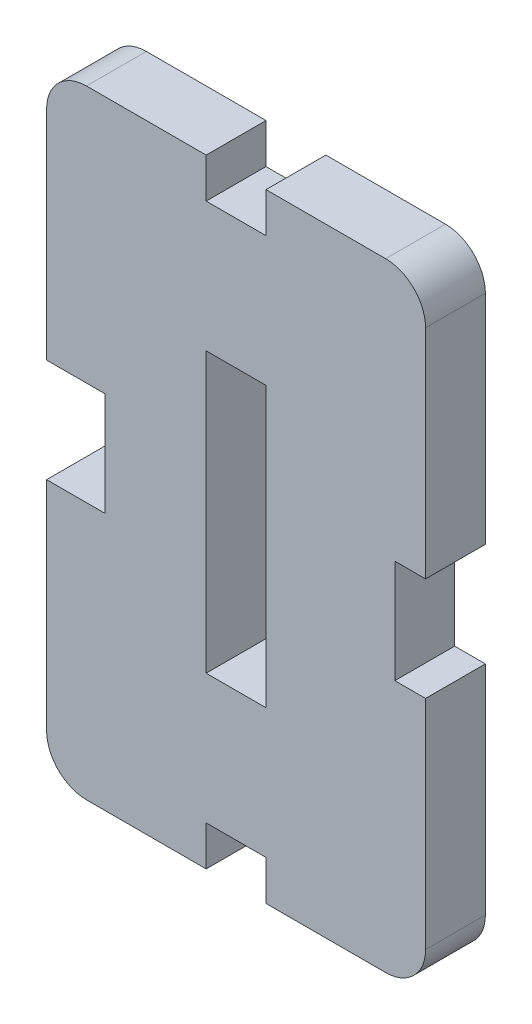
ISO-10303-21;
HEADER;
FILE_DESCRIPTION(('STEP AP214'),'2;1');
FILE_NAME('part.step','',(''),(''),'','','');
FILE_SCHEMA(('AUTOMOTIVE_DESIGN { 1 0 10303 214 1 1 1 1 }'));
ENDSEC;
DATA;
#1=APPLICATION_CONTEXT('core data for automotive mechanical design processes');
#2=APPLICATION_PROTOCOL_DEFINITION('international standard','automotive_design',2000,#1);
#3=PRODUCT_CONTEXT('',#1,'mechanical');
#4=PRODUCT('Part','Part','',(#3));
#5=PRODUCT_RELATED_PRODUCT_CATEGORY('part','',(#4));
#6=PRODUCT_DEFINITION_FORMATION('','',#4);
#7=PRODUCT_DEFINITION_CONTEXT('part definition',#1,'design');
#8=PRODUCT_DEFINITION('design','',#6,#7);
#9=PRODUCT_DEFINITION_SHAPE('','',#8);
#10=(LENGTH_UNIT() NAMED_UNIT(*) SI_UNIT(.MILLI.,.METRE.));
#11=(NAMED_UNIT(*) PLANE_ANGLE_UNIT() SI_UNIT($,.RADIAN.));
#12=(NAMED_UNIT(*) SI_UNIT($,.STERADIAN.) SOLID_ANGLE_UNIT());
#13=UNCERTAINTY_MEASURE_WITH_UNIT(LENGTH_MEASURE(1.E-05),#10,'distance_accuracy_value','');
#14=(GEOMETRIC_REPRESENTATION_CONTEXT(3) GLOBAL_UNCERTAINTY_ASSIGNED_CONTEXT((#13)) GLOBAL_UNIT_ASSIGNED_CONTEXT((#10,
#11,#12)) REPRESENTATION_CONTEXT('',''));
#15=CARTESIAN_POINT('',(0.,0.,0.));
#16=DIRECTION('',(0.,0.,1.));
#17=DIRECTION('',(1.,0.,0.));
#18=AXIS2_PLACEMENT_3D('',#15,#16,#17);
#19=CARTESIAN_POINT('',(-1050.11691061095,53.9977448376062,3.00000000000038));
#20=DIRECTION('',(0.,0.,-1.));
#21=DIRECTION('',(-1.,0.,0.));
#22=AXIS2_PLACEMENT_3D('',#19,#20,#21);
#23=PLANE('',#22);
#24=CARTESIAN_POINT('',(-1050.11691061095,53.9977448376062,3.00000000000038));
#25=DIRECTION('',(0.,0.,1.));
#26=DIRECTION('',(-1.,0.,0.));
#27=AXIS2_PLACEMENT_3D('',#24,#25,#26);
#28=CIRCLE('',#27,2.);
#29=CARTESIAN_POINT('',(-1050.11691061095,55.9977448376063,3.00000000000045));
#30=VERTEX_POINT('',#29);
#31=CARTESIAN_POINT('',(-1052.11691061095,53.9977448376064,3.00000000000049));
#32=VERTEX_POINT('',#31);
#33=EDGE_CURVE('E303',#30,#32,#28,.T.);
#34=ORIENTED_EDGE('',*,*,#33,.T.);
#35=DIRECTION('',(0.,-1.,0.));
#36=VECTOR('',#35,1.);
#37=CARTESIAN_POINT('',(-1052.11691061095,43.093073911834,3.00000000000038));
#38=LINE('',#37,#36);
#39=CARTESIAN_POINT('',(-1052.11691061095,43.093073911834,3.00000000000038));
#40=VERTEX_POINT('',#39);
#41=EDGE_CURVE('E306',#32,#40,#38,.T.);
#42=ORIENTED_EDGE('',*,*,#41,.T.);
#43=DIRECTION('',(1.,0.,0.));
#44=VECTOR('',#43,1.);
#45=CARTESIAN_POINT('',(-1049.19041833405,43.0930739118337,3.00000000000042));
#46=LINE('',#45,#44);
#47=CARTESIAN_POINT('',(-1049.19041833405,43.0930739118337,3.00000000000042));
#48=VERTEX_POINT('',#47);
#49=EDGE_CURVE('E308',#40,#48,#46,.T.);
#50=ORIENTED_EDGE('',*,*,#49,.T.);
#51=DIRECTION('',(0.,-1.,0.));
#52=VECTOR('',#51,1.);
#53=CARTESIAN_POINT('',(-1049.19041833405,37.9024157633789,3.00000000000038));
#54=LINE('',#53,#52);
#55=CARTESIAN_POINT('',(-1049.19041833405,37.9024157633789,3.00000000000038));
#56=VERTEX_POINT('',#55);
#57=EDGE_CURVE('E310',#48,#56,#54,.T.);
#58=ORIENTED_EDGE('',*,*,#57,.T.);
#59=DIRECTION('',(-1.,0.,0.));
#60=VECTOR('',#59,1.);
#61=CARTESIAN_POINT('',(-1049.19041833405,37.9024157633789,3.00000000000038));
#62=LINE('',#61,#60);
#63=CARTESIAN_POINT('',(-1052.11691061095,37.9024157633791,3.00000000000039));
#64=VERTEX_POINT('',#63);
#65=EDGE_CURVE('E312',#56,#64,#62,.T.);
#66=ORIENTED_EDGE('',*,*,#65,.T.);
#67=DIRECTION('',(0.,-1.,0.));
#68=VECTOR('',#67,1.);
#69=CARTESIAN_POINT('',(-1052.11691061095,37.9024157633791,3.00000000000039));
#70=LINE('',#69,#68);
#71=CARTESIAN_POINT('',(-1052.11691061095,26.9977448376063,3.00000000000045));
#72=VERTEX_POINT('',#71);
#73=EDGE_CURVE('E314',#64,#72,#70,.T.);
#74=ORIENTED_EDGE('',*,*,#73,.T.);
#75=CARTESIAN_POINT('',(-1050.11691061095,26.9977448376061,3.00000000000056));
#76=DIRECTION('',(0.,0.,1.));
#77=DIRECTION('',(1.,0.,0.));
#78=AXIS2_PLACEMENT_3D('',#75,#76,#77);
#79=CIRCLE('',#78,2.00000000000011);
#80=CARTESIAN_POINT('',(-1050.11691061095,24.9977448376062,3.00000000000047));
#81=VERTEX_POINT('',#80);
#82=EDGE_CURVE('E316',#72,#81,#79,.T.);
#83=ORIENTED_EDGE('',*,*,#82,.T.);
#84=DIRECTION('',(1.,0.,0.));
#85=VECTOR('',#84,1.);
#86=CARTESIAN_POINT('',(-1050.11691061095,24.9977448376063,3.00000000000038));
#87=LINE('',#86,#85);
#88=CARTESIAN_POINT('',(-1044.11691061095,24.9977448376066,3.00000000000061));
#89=VERTEX_POINT('',#88);
#90=EDGE_CURVE('E318',#81,#89,#87,.T.);
#91=ORIENTED_EDGE('',*,*,#90,.T.);
#92=DIRECTION('',(0.,1.,0.));
#93=VECTOR('',#92,1.);
#94=CARTESIAN_POINT('',(-1044.11691061095,26.9977448376066,3.00000000000067));
#95=LINE('',#94,#93);
#96=CARTESIAN_POINT('',(-1044.11691061095,26.9977448376066,3.00000000000067));
#97=VERTEX_POINT('',#96);
#98=EDGE_CURVE('E320',#89,#97,#95,.T.);
#99=ORIENTED_EDGE('',*,*,#98,.T.);
#100=DIRECTION('',(1.,0.,0.));
#101=VECTOR('',#100,1.);
#102=CARTESIAN_POINT('',(-1042.61691061095,26.9977448376064,3.00000000000041));
#103=LINE('',#102,#101);
#104=CARTESIAN_POINT('',(-1041.11691061095,26.9977448376063,3.00000000000039));
#105=VERTEX_POINT('',#104);
#106=EDGE_CURVE('E322',#97,#105,#103,.T.);
#107=ORIENTED_EDGE('',*,*,#106,.T.);
#108=DIRECTION('',(0.,-1.,0.));
#109=VECTOR('',#108,1.);
#110=CARTESIAN_POINT('',(-1041.11691061095,26.9977448376063,3.00000000000039));
#111=LINE('',#110,#109);
#112=CARTESIAN_POINT('',(-1041.11691061095,24.9977448376063,3.00000000000035));
#113=VERTEX_POINT('',#112);
#114=EDGE_CURVE('E324',#105,#113,#111,.T.);
#115=ORIENTED_EDGE('',*,*,#114,.T.);
#116=DIRECTION('',(1.,0.,0.));
#117=VECTOR('',#116,1.);
#118=CARTESIAN_POINT('',(-1041.11691061095,24.9977448376063,3.00000000000035));
#119=LINE('',#118,#117);
#120=CARTESIAN_POINT('',(-1035.11691061095,24.9977448376063,3.00000000000034));
#121=VERTEX_POINT('',#120);
#122=EDGE_CURVE('E326',#113,#121,#119,.T.);
#123=ORIENTED_EDGE('',*,*,#122,.T.);
#124=CARTESIAN_POINT('',(-1035.11691061095,26.9977448376062,3.00000000000032));
#125=DIRECTION('',(0.,0.,1.));
#126=DIRECTION('',(-1.,0.,0.));
#127=AXIS2_PLACEMENT_3D('',#124,#125,#126);
#128=CIRCLE('',#127,2.);
#129=CARTESIAN_POINT('',(-1033.11691061095,26.9977448376063,3.0000000000005));
#130=VERTEX_POINT('',#129);
#131=EDGE_CURVE('E328',#121,#130,#128,.T.);
#132=ORIENTED_EDGE('',*,*,#131,.T.);
#133=DIRECTION('',(0.,1.,0.));
#134=VECTOR('',#133,1.);
#135=CARTESIAN_POINT('',(-1033.11691061095,26.9977448376063,3.0000000000005));
#136=LINE('',#135,#134);
#137=CARTESIAN_POINT('',(-1033.11691061095,37.902415763379,3.00000000000042));
#138=VERTEX_POINT('',#137);
#139=EDGE_CURVE('E330',#130,#138,#136,.T.);
#140=ORIENTED_EDGE('',*,*,#139,.T.);
#141=DIRECTION('',(-0.999999999999999,0.,0.));
#142=VECTOR('',#141,1.);
#143=CARTESIAN_POINT('',(-1033.11691061095,37.902415763379,3.00000000000042));
#144=LINE('',#143,#142);
#145=CARTESIAN_POINT('',(-1034.65769352971,37.9024157633789,3.00000000000046));
#146=VERTEX_POINT('',#145);
#147=EDGE_CURVE('E332',#138,#146,#144,.T.);
#148=ORIENTED_EDGE('',*,*,#147,.T.);
#149=DIRECTION('',(0.,1.,0.));
#150=VECTOR('',#149,1.);
#151=CARTESIAN_POINT('',(-1034.65769352971,43.0930739118337,3.00000000000032));
#152=LINE('',#151,#150);
#153=CARTESIAN_POINT('',(-1034.65769352971,43.0930739118337,3.00000000000032));
#154=VERTEX_POINT('',#153);
#155=EDGE_CURVE('E334',#146,#154,#152,.T.);
#156=ORIENTED_EDGE('',*,*,#155,.T.);
#157=DIRECTION('',(0.999999999999999,0.,0.));
#158=VECTOR('',#157,1.);
#159=CARTESIAN_POINT('',(-1033.11691061095,43.0930739118337,3.00000000000043));
#160=LINE('',#159,#158);
#161=CARTESIAN_POINT('',(-1033.11691061095,43.0930739118337,3.00000000000043));
#162=VERTEX_POINT('',#161);
#163=EDGE_CURVE('E336',#154,#162,#160,.T.);
#164=ORIENTED_EDGE('',*,*,#163,.T.);
#165=DIRECTION('',(0.,1.,0.));
#166=VECTOR('',#165,1.);
#167=CARTESIAN_POINT('',(-1033.11691061095,53.9977448376064,3.00000000000049));
#168=LINE('',#167,#166);
#169=CARTESIAN_POINT('',(-1033.11691061095,53.9977448376064,3.00000000000049));
#170=VERTEX_POINT('',#169);
#171=EDGE_CURVE('E338',#162,#170,#168,.T.);
#172=ORIENTED_EDGE('',*,*,#171,.T.);
#173=CARTESIAN_POINT('',(-1035.11691061095,53.9977448376063,3.00000000000039));
#174=DIRECTION('',(0.,0.,1.));
#175=DIRECTION('',(1.,0.,0.));
#176=AXIS2_PLACEMENT_3D('',#173,#174,#175);
#177=CIRCLE('',#176,2.);
#178=CARTESIAN_POINT('',(-1035.11691061095,55.9977448376063,3.00000000000036));
#179=VERTEX_POINT('',#178);
#180=EDGE_CURVE('E340',#170,#179,#177,.T.);
#181=ORIENTED_EDGE('',*,*,#180,.T.);
#182=DIRECTION('',(-1.,0.,0.));
#183=VECTOR('',#182,1.);
#184=CARTESIAN_POINT('',(-1041.11691061095,55.9977448376064,3.00000000000034));
#185=LINE('',#184,#183);
#186=CARTESIAN_POINT('',(-1041.11691061095,55.9977448376064,3.00000000000034));
#187=VERTEX_POINT('',#186);
#188=EDGE_CURVE('E342',#179,#187,#185,.T.);
#189=ORIENTED_EDGE('',*,*,#188,.T.);
#190=DIRECTION('',(0.,-1.,0.));
#191=VECTOR('',#190,1.);
#192=CARTESIAN_POINT('',(-1041.11691061095,53.9977448376065,3.00000000000043));
#193=LINE('',#192,#191);
#194=CARTESIAN_POINT('',(-1041.11691061095,53.9977448376065,3.00000000000043));
#195=VERTEX_POINT('',#194);
#196=EDGE_CURVE('E344',#187,#195,#193,.T.);
#197=ORIENTED_EDGE('',*,*,#196,.T.);
#198=DIRECTION('',(-1.,0.,0.));
#199=VECTOR('',#198,1.);
#200=CARTESIAN_POINT('',(-1042.61691061095,53.9977448376063,3.00000000000035));
#201=LINE('',#200,#199);
#202=CARTESIAN_POINT('',(-1044.11691061095,53.9977448376064,3.00000000000056));
#203=VERTEX_POINT('',#202);
#204=EDGE_CURVE('E346',#195,#203,#201,.T.);
#205=ORIENTED_EDGE('',*,*,#204,.T.);
#206=DIRECTION('',(0.,1.,0.));
#207=VECTOR('',#206,1.);
#208=CARTESIAN_POINT('',(-1044.11691061095,53.9977448376064,3.00000000000056));
#209=LINE('',#208,#207);
#210=CARTESIAN_POINT('',(-1044.11691061095,55.9977448376066,3.00000000000063));
#211=VERTEX_POINT('',#210);
#212=EDGE_CURVE('E348',#203,#211,#209,.T.);
#213=ORIENTED_EDGE('',*,*,#212,.T.);
#214=DIRECTION('',(-1.,0.,0.));
#215=VECTOR('',#214,1.);
#216=CARTESIAN_POINT('',(-1050.11691061095,55.9977448376063,3.00000000000045));
#217=LINE('',#216,#215);
#218=EDGE_CURVE('E350',#211,#30,#217,.T.);
#219=ORIENTED_EDGE('',*,*,#218,.T.);
#220=EDGE_LOOP('',(#34,#42,#50,#58,#66,#74,#83,#91,#99,#107,#115,#123,#132,#140,#148,#156,#164,
#172,#181,#189,#197,#205,#213,#219));
#221=FACE_BOUND('',#220,.T.);
#222=DIRECTION('',(-1.,0.,0.));
#223=VECTOR('',#222,1.);
#224=CARTESIAN_POINT('',(-1041.11691061095,47.4977448376063,3.00000000000041));
#225=LINE('',#224,#223);
#226=CARTESIAN_POINT('',(-1041.11691061095,47.4977448376063,3.00000000000041));
#227=VERTEX_POINT('',#226);
#228=CARTESIAN_POINT('',(-1044.11691061095,47.4977448376066,3.00000000000046));
#229=VERTEX_POINT('',#228);
#230=EDGE_CURVE('E232',#227,#229,#225,.T.);
#231=ORIENTED_EDGE('',*,*,#230,.F.);
#232=DIRECTION('',(0.,1.,0.));
#233=VECTOR('',#232,1.);
#234=CARTESIAN_POINT('',(-1041.11691061095,33.4977448376063,3.00000000000035));
#235=LINE('',#234,#233);
#236=CARTESIAN_POINT('',(-1041.11691061095,33.4977448376063,3.00000000000035));
#237=VERTEX_POINT('',#236);
#238=EDGE_CURVE('E247',#237,#227,#235,.T.);
#239=ORIENTED_EDGE('',*,*,#238,.F.);
#240=DIRECTION('',(1.,0.,0.));
#241=VECTOR('',#240,1.);
#242=CARTESIAN_POINT('',(-1041.11691061095,33.4977448376063,3.00000000000035));
#243=LINE('',#242,#241);
#244=CARTESIAN_POINT('',(-1044.11691061095,33.4977448376066,3.00000000000053));
#245=VERTEX_POINT('',#244);
#246=EDGE_CURVE('E245',#245,#237,#243,.T.);
#247=ORIENTED_EDGE('',*,*,#246,.F.);
#248=DIRECTION('',(0.,-1.,0.));
#249=VECTOR('',#248,1.);
#250=CARTESIAN_POINT('',(-1044.11691061095,47.4977448376066,3.00000000000046));
#251=LINE('',#250,#249);
#252=EDGE_CURVE('E243',#229,#245,#251,.T.);
#253=ORIENTED_EDGE('',*,*,#252,.F.);
#254=EDGE_LOOP('',(#231,#239,#247,#253));
#255=FACE_BOUND('',#254,.T.);
#256=ADVANCED_FACE('F32',(#221,#255),#23,.F.);
#257=CARTESIAN_POINT('',(-1050.11691061095,53.9977448376063,3.7470027081099E-13));
#258=DIRECTION('',(0.,0.,-1.));
#259=DIRECTION('',(-1.,0.,0.));
#260=AXIS2_PLACEMENT_3D('',#257,#258,#259);
#261=PLANE('',#260);
#262=CARTESIAN_POINT('',(-1050.11691061095,53.9977448376063,3.7470027081099E-13));
#263=DIRECTION('',(0.,0.,1.));
#264=DIRECTION('',(-1.,0.,0.));
#265=AXIS2_PLACEMENT_3D('',#262,#263,#264);
#266=CIRCLE('',#265,2.);
#267=CARTESIAN_POINT('',(-1050.11691061095,55.9977448376063,5.27355936696949E-13));
#268=VERTEX_POINT('',#267);
#269=CARTESIAN_POINT('',(-1052.11691061095,53.9977448376064,3.60822483003176E-13));
#270=VERTEX_POINT('',#269);
#271=EDGE_CURVE('E233',#268,#270,#266,.T.);
#272=ORIENTED_EDGE('',*,*,#271,.F.);
#273=DIRECTION('',(-1.,0.,0.));
#274=VECTOR('',#273,1.);
#275=CARTESIAN_POINT('',(-1050.11691061095,55.9977448376063,5.27355936696949E-13));
#276=LINE('',#275,#274);
#277=CARTESIAN_POINT('',(-1044.11691061095,55.9977448376066,6.52256026967279E-13));
#278=VERTEX_POINT('',#277);
#279=EDGE_CURVE('E301',#278,#268,#276,.T.);
#280=ORIENTED_EDGE('',*,*,#279,.F.);
#281=DIRECTION('',(0.,1.,0.));
#282=VECTOR('',#281,1.);
#283=CARTESIAN_POINT('',(-1044.11691061095,53.9977448376066,6.66133814775094E-13));
#284=LINE('',#283,#282);
#285=CARTESIAN_POINT('',(-1044.11691061095,53.9977448376066,6.66133814775094E-13));
#286=VERTEX_POINT('',#285);
#287=EDGE_CURVE('E299',#286,#278,#284,.T.);
#288=ORIENTED_EDGE('',*,*,#287,.F.);
#289=DIRECTION('',(-1.,0.,0.));
#290=VECTOR('',#289,1.);
#291=CARTESIAN_POINT('',(-1042.61691061095,53.9977448376063,3.88578058618805E-13));
#292=LINE('',#291,#290);
#293=CARTESIAN_POINT('',(-1041.11691061095,53.9977448376064,3.46944695195361E-13));
#294=VERTEX_POINT('',#293);
#295=EDGE_CURVE('E297',#294,#286,#292,.T.);
#296=ORIENTED_EDGE('',*,*,#295,.F.);
#297=DIRECTION('',(0.,-1.,0.));
#298=VECTOR('',#297,1.);
#299=CARTESIAN_POINT('',(-1041.11691061095,53.9977448376064,3.46944695195361E-13));
#300=LINE('',#299,#298);
#301=CARTESIAN_POINT('',(-1041.11691061095,55.9977448376064,4.16333634234434E-13));
#302=VERTEX_POINT('',#301);
#303=EDGE_CURVE('E294',#302,#294,#300,.T.);
#304=ORIENTED_EDGE('',*,*,#303,.F.);
#305=DIRECTION('',(-1.,0.,0.));
#306=VECTOR('',#305,1.);
#307=CARTESIAN_POINT('',(-1041.11691061095,55.9977448376064,4.16333634234434E-13));
#308=LINE('',#307,#306);
#309=CARTESIAN_POINT('',(-1035.11691061095,55.9977448376063,3.88578058618805E-13));
#310=VERTEX_POINT('',#309);
#311=EDGE_CURVE('E292',#310,#302,#308,.T.);
#312=ORIENTED_EDGE('',*,*,#311,.F.);
#313=CARTESIAN_POINT('',(-1035.11691061095,53.9977448376063,3.33066907387547E-13));
#314=DIRECTION('',(0.,0.,1.));
#315=DIRECTION('',(1.,0.,0.));
#316=AXIS2_PLACEMENT_3D('',#313,#314,#315);
#317=CIRCLE('',#316,2.);
#318=CARTESIAN_POINT('',(-1033.11691061095,53.9977448376063,5.13478148889135E-13));
#319=VERTEX_POINT('',#318);
#320=EDGE_CURVE('E290',#319,#310,#317,.T.);
#321=ORIENTED_EDGE('',*,*,#320,.F.);
#322=DIRECTION('',(0.,1.,0.));
#323=VECTOR('',#322,1.);
#324=CARTESIAN_POINT('',(-1033.11691061095,53.9977448376063,5.13478148889135E-13));
#325=LINE('',#324,#323);
#326=CARTESIAN_POINT('',(-1033.11691061095,43.0930739118338,4.85722573273506E-13));
#327=VERTEX_POINT('',#326);
#328=EDGE_CURVE('E288',#327,#319,#325,.T.);
#329=ORIENTED_EDGE('',*,*,#328,.F.);
#330=DIRECTION('',(0.999999999999999,0.,0.));
#331=VECTOR('',#330,1.);
#332=CARTESIAN_POINT('',(-1033.11691061095,43.0930739118338,4.85722573273506E-13));
#333=LINE('',#332,#331);
#334=CARTESIAN_POINT('',(-1034.65769352971,43.0930739118337,3.19189119579733E-13));
#335=VERTEX_POINT('',#334);
#336=EDGE_CURVE('E286',#335,#327,#333,.T.);
#337=ORIENTED_EDGE('',*,*,#336,.F.);
#338=DIRECTION('',(0.,1.,0.));
#339=VECTOR('',#338,1.);
#340=CARTESIAN_POINT('',(-1034.65769352971,43.0930739118337,3.19189119579733E-13));
#341=LINE('',#340,#339);
#342=CARTESIAN_POINT('',(-1034.65769352971,37.9024157633789,2.35922392732846E-13));
#343=VERTEX_POINT('',#342);
#344=EDGE_CURVE('E284',#343,#335,#341,.T.);
#345=ORIENTED_EDGE('',*,*,#344,.F.);
#346=DIRECTION('',(-0.999999999999999,0.,0.));
#347=VECTOR('',#346,1.);
#348=CARTESIAN_POINT('',(-1033.11691061095,37.9024157633789,4.44089209850063E-13));
#349=LINE('',#348,#347);
#350=CARTESIAN_POINT('',(-1033.11691061095,37.9024157633789,4.44089209850063E-13));
#351=VERTEX_POINT('',#350);
#352=EDGE_CURVE('E282',#351,#343,#349,.T.);
#353=ORIENTED_EDGE('',*,*,#352,.F.);
#354=DIRECTION('',(0.,1.,0.));
#355=VECTOR('',#354,1.);
#356=CARTESIAN_POINT('',(-1033.11691061095,26.9977448376063,4.44089209850063E-13));
#357=LINE('',#356,#355);
#358=CARTESIAN_POINT('',(-1033.11691061095,26.9977448376063,4.44089209850063E-13));
#359=VERTEX_POINT('',#358);
#360=EDGE_CURVE('E280',#359,#351,#357,.T.);
#361=ORIENTED_EDGE('',*,*,#360,.F.);
#362=CARTESIAN_POINT('',(-1035.11691061095,26.9977448376063,3.19189119579733E-13));
#363=DIRECTION('',(0.,0.,1.));
#364=DIRECTION('',(-1.,0.,0.));
#365=AXIS2_PLACEMENT_3D('',#362,#363,#364);
#366=CIRCLE('',#365,2.);
#367=CARTESIAN_POINT('',(-1035.11691061095,24.9977448376063,3.46944695195361E-13));
#368=VERTEX_POINT('',#367);
#369=EDGE_CURVE('E278',#368,#359,#366,.T.);
#370=ORIENTED_EDGE('',*,*,#369,.F.);
#371=DIRECTION('',(1.,0.,0.));
#372=VECTOR('',#371,1.);
#373=CARTESIAN_POINT('',(-1041.11691061095,24.9977448376063,3.33066907387547E-13));
#374=LINE('',#373,#372);
#375=CARTESIAN_POINT('',(-1041.11691061095,24.9977448376063,3.33066907387547E-13));
#376=VERTEX_POINT('',#375);
#377=EDGE_CURVE('E276',#376,#368,#374,.T.);
#378=ORIENTED_EDGE('',*,*,#377,.F.);
#379=DIRECTION('',(0.,-1.,0.));
#380=VECTOR('',#379,1.);
#381=CARTESIAN_POINT('',(-1041.11691061095,26.9977448376064,4.57966997657877E-13));
#382=LINE('',#381,#380);
#383=CARTESIAN_POINT('',(-1041.11691061095,26.9977448376064,4.57966997657877E-13));
#384=VERTEX_POINT('',#383);
#385=EDGE_CURVE('E274',#384,#376,#382,.T.);
#386=ORIENTED_EDGE('',*,*,#385,.F.);
#387=DIRECTION('',(1.,0.,0.));
#388=VECTOR('',#387,1.);
#389=CARTESIAN_POINT('',(-1042.61691061095,26.9977448376063,4.30211422042248E-13));
#390=LINE('',#389,#388);
#391=CARTESIAN_POINT('',(-1044.11691061095,26.9977448376065,5.96744875736022E-13));
#392=VERTEX_POINT('',#391);
#393=EDGE_CURVE('E272',#392,#384,#390,.T.);
#394=ORIENTED_EDGE('',*,*,#393,.F.);
#395=DIRECTION('',(0.,1.,0.));
#396=VECTOR('',#395,1.);
#397=CARTESIAN_POINT('',(-1044.11691061095,26.9977448376065,5.96744875736022E-13));
#398=LINE('',#397,#396);
#399=CARTESIAN_POINT('',(-1044.11691061095,24.9977448376066,5.41233724504764E-13));
#400=VERTEX_POINT('',#399);
#401=EDGE_CURVE('E269',#400,#392,#398,.T.);
#402=ORIENTED_EDGE('',*,*,#401,.F.);
#403=DIRECTION('',(1.,0.,0.));
#404=VECTOR('',#403,1.);
#405=CARTESIAN_POINT('',(-1050.11691061095,24.9977448376063,4.71844785465692E-13));
#406=LINE('',#405,#404);
#407=CARTESIAN_POINT('',(-1050.11691061095,24.9977448376062,5.13478148889135E-13));
#408=VERTEX_POINT('',#407);
#409=EDGE_CURVE('E267',#408,#400,#406,.T.);
#410=ORIENTED_EDGE('',*,*,#409,.F.);
#411=CARTESIAN_POINT('',(-1050.11691061095,26.9977448376064,4.30211422042248E-13));
#412=DIRECTION('',(0.,0.,1.));
#413=DIRECTION('',(1.,0.,0.));
#414=AXIS2_PLACEMENT_3D('',#411,#412,#413);
#415=CIRCLE('',#414,2.00000000000011);
#416=CARTESIAN_POINT('',(-1052.11691061095,26.9977448376064,4.57966997657877E-13));
#417=VERTEX_POINT('',#416);
#418=EDGE_CURVE('E265',#417,#408,#415,.T.);
#419=ORIENTED_EDGE('',*,*,#418,.F.);
#420=DIRECTION('',(0.,-1.,0.));
#421=VECTOR('',#420,1.);
#422=CARTESIAN_POINT('',(-1052.11691061095,37.9024157633791,4.30211422042248E-13));
#423=LINE('',#422,#421);
#424=CARTESIAN_POINT('',(-1052.11691061095,37.9024157633791,4.30211422042248E-13));
#425=VERTEX_POINT('',#424);
#426=EDGE_CURVE('E263',#425,#417,#423,.T.);
#427=ORIENTED_EDGE('',*,*,#426,.F.);
#428=DIRECTION('',(-1.,0.,0.));
#429=VECTOR('',#428,1.);
#430=CARTESIAN_POINT('',(-1049.19041833405,37.9024157633789,3.19189119579733E-13));
#431=LINE('',#430,#429);
#432=CARTESIAN_POINT('',(-1049.19041833405,37.9024157633789,3.19189119579733E-13));
#433=VERTEX_POINT('',#432);
#434=EDGE_CURVE('E261',#433,#425,#431,.T.);
#435=ORIENTED_EDGE('',*,*,#434,.F.);
#436=DIRECTION('',(0.,-1.,0.));
#437=VECTOR('',#436,1.);
#438=CARTESIAN_POINT('',(-1049.19041833405,37.9024157633789,3.19189119579733E-13));
#439=LINE('',#438,#437);
#440=CARTESIAN_POINT('',(-1049.19041833405,43.0930739118337,3.46944695195361E-13));
#441=VERTEX_POINT('',#440);
#442=EDGE_CURVE('E259',#441,#433,#439,.T.);
#443=ORIENTED_EDGE('',*,*,#442,.F.);
#444=DIRECTION('',(1.,0.,0.));
#445=VECTOR('',#444,1.);
#446=CARTESIAN_POINT('',(-1049.19041833405,43.0930739118337,3.46944695195361E-13));
#447=LINE('',#446,#445);
#448=CARTESIAN_POINT('',(-1052.11691061095,43.093073911834,4.16333634234434E-13));
#449=VERTEX_POINT('',#448);
#450=EDGE_CURVE('E257',#449,#441,#447,.T.);
#451=ORIENTED_EDGE('',*,*,#450,.F.);
#452=DIRECTION('',(0.,-1.,0.));
#453=VECTOR('',#452,1.);
#454=CARTESIAN_POINT('',(-1052.11691061095,43.093073911834,4.16333634234434E-13));
#455=LINE('',#454,#453);
#456=EDGE_CURVE('E255',#270,#449,#455,.T.);
#457=ORIENTED_EDGE('',*,*,#456,.F.);
#458=EDGE_LOOP('',(#272,#280,#288,#296,#304,#312,#321,#329,#337,#345,#353,#361,#370,#378,#386,
#394,#402,#410,#419,#427,#435,#443,#451,#457));
#459=FACE_BOUND('',#458,.T.);
#460=DIRECTION('',(0.,1.,0.));
#461=VECTOR('',#460,1.);
#462=CARTESIAN_POINT('',(-1041.11691061095,33.4977448376063,3.46944695195361E-13));
#463=LINE('',#462,#461);
#464=CARTESIAN_POINT('',(-1041.11691061095,33.4977448376063,3.46944695195361E-13));
#465=VERTEX_POINT('',#464);
#466=CARTESIAN_POINT('',(-1041.11691061095,47.4977448376063,3.19189119579733E-13));
#467=VERTEX_POINT('',#466);
#468=EDGE_CURVE('E237',#465,#467,#463,.T.);
#469=ORIENTED_EDGE('',*,*,#468,.T.);
#470=DIRECTION('',(-1.,0.,0.));
#471=VECTOR('',#470,1.);
#472=CARTESIAN_POINT('',(-1041.11691061095,47.4977448376063,3.19189119579733E-13));
#473=LINE('',#472,#471);
#474=CARTESIAN_POINT('',(-1044.11691061095,47.4977448376065,4.44089209850063E-13));
#475=VERTEX_POINT('',#474);
#476=EDGE_CURVE('E55',#467,#475,#473,.T.);
#477=ORIENTED_EDGE('',*,*,#476,.T.);
#478=DIRECTION('',(0.,-1.,0.));
#479=VECTOR('',#478,1.);
#480=CARTESIAN_POINT('',(-1044.11691061095,47.4977448376065,4.44089209850063E-13));
#481=LINE('',#480,#479);
#482=CARTESIAN_POINT('',(-1044.11691061095,33.4977448376066,4.57966997657877E-13));
#483=VERTEX_POINT('',#482);
#484=EDGE_CURVE('E219',#475,#483,#481,.T.);
#485=ORIENTED_EDGE('',*,*,#484,.T.);
#486=DIRECTION('',(1.,0.,0.));
#487=VECTOR('',#486,1.);
#488=CARTESIAN_POINT('',(-1041.11691061095,33.4977448376063,3.46944695195361E-13));
#489=LINE('',#488,#487);
#490=EDGE_CURVE('E228',#483,#465,#489,.T.);
#491=ORIENTED_EDGE('',*,*,#490,.T.);
#492=EDGE_LOOP('',(#469,#477,#485,#491));
#493=FACE_BOUND('',#492,.T.);
#494=ADVANCED_FACE('F236',(#459,#493),#261,.T.);
#495=CARTESIAN_POINT('',(-1050.11691061095,53.9977448376062,3.00000000000038));
#496=DIRECTION('',(0.,0.,-1.));
#497=DIRECTION('',(-1.,0.,0.));
#498=AXIS2_PLACEMENT_3D('',#495,#496,#497);
#499=CYLINDRICAL_SURFACE('',#498,2.);
#500=ORIENTED_EDGE('',*,*,#271,.T.);
#501=DIRECTION('',(0.,0.,-1.));
#502=VECTOR('',#501,1.);
#503=CARTESIAN_POINT('',(-1052.11691061095,53.9977448376064,3.00000000000049));
#504=LINE('',#503,#502);
#505=EDGE_CURVE('E11',#32,#270,#504,.T.);
#506=ORIENTED_EDGE('',*,*,#505,.F.);
#507=ORIENTED_EDGE('',*,*,#33,.F.);
#508=DIRECTION('',(0.,0.,-1.));
#509=VECTOR('',#508,1.);
#510=CARTESIAN_POINT('',(-1050.11691061095,55.9977448376063,3.00000000000045));
#511=LINE('',#510,#509);
#512=EDGE_CURVE('E352',#30,#268,#511,.T.);
#513=ORIENTED_EDGE('',*,*,#512,.T.);
#514=EDGE_LOOP('',(#500,#506,#507,#513));
#515=FACE_BOUND('',#514,.T.);
#516=ADVANCED_FACE('F34',(#515),#499,.T.);
#517=CARTESIAN_POINT('',(-1052.11691061095,43.093073911834,3.00000000000038));
#518=DIRECTION('',(0.999999999999999,0.,0.));
#519=DIRECTION('',(0.,1.,0.));
#520=AXIS2_PLACEMENT_3D('',#517,#518,#519);
#521=PLANE('',#520);
#522=ORIENTED_EDGE('',*,*,#456,.T.);
#523=DIRECTION('',(0.,0.,-1.));
#524=VECTOR('',#523,1.);
#525=CARTESIAN_POINT('',(-1052.11691061095,43.093073911834,3.00000000000038));
#526=LINE('',#525,#524);
#527=EDGE_CURVE('E40',#40,#449,#526,.T.);
#528=ORIENTED_EDGE('',*,*,#527,.F.);
#529=ORIENTED_EDGE('',*,*,#41,.F.);
#530=ORIENTED_EDGE('',*,*,#505,.T.);
#531=EDGE_LOOP('',(#522,#528,#529,#530));
#532=FACE_BOUND('',#531,.T.);
#533=ADVANCED_FACE('F444',(#532),#521,.F.);
#534=CARTESIAN_POINT('',(-1049.19041833405,43.0930739118337,3.00000000000042));
#535=DIRECTION('',(0.,1.,0.));
#536=DIRECTION('',(0.,0.,1.));
#537=AXIS2_PLACEMENT_3D('',#534,#535,#536);
#538=PLANE('',#537);
#539=ORIENTED_EDGE('',*,*,#450,.T.);
#540=DIRECTION('',(0.,0.,-1.));
#541=VECTOR('',#540,1.);
#542=CARTESIAN_POINT('',(-1049.19041833405,43.0930739118337,3.00000000000042));
#543=LINE('',#542,#541);
#544=EDGE_CURVE('E415',#48,#441,#543,.T.);
#545=ORIENTED_EDGE('',*,*,#544,.F.);
#546=ORIENTED_EDGE('',*,*,#49,.F.);
#547=ORIENTED_EDGE('',*,*,#527,.T.);
#548=EDGE_LOOP('',(#539,#545,#546,#547));
#549=FACE_BOUND('',#548,.T.);
#550=ADVANCED_FACE('F422',(#549),#538,.F.);
#551=CARTESIAN_POINT('',(-1049.19041833405,37.9024157633789,3.00000000000038));
#552=DIRECTION('',(1.,0.,0.));
#553=DIRECTION('',(0.,0.,-1.));
#554=AXIS2_PLACEMENT_3D('',#551,#552,#553);
#555=PLANE('',#554);
#556=ORIENTED_EDGE('',*,*,#442,.T.);
#557=DIRECTION('',(0.,0.,-1.));
#558=VECTOR('',#557,1.);
#559=CARTESIAN_POINT('',(-1049.19041833405,37.9024157633789,3.00000000000038));
#560=LINE('',#559,#558);
#561=EDGE_CURVE('E412',#56,#433,#560,.T.);
#562=ORIENTED_EDGE('',*,*,#561,.F.);
#563=ORIENTED_EDGE('',*,*,#57,.F.);
#564=ORIENTED_EDGE('',*,*,#544,.T.);
#565=EDGE_LOOP('',(#556,#562,#563,#564));
#566=FACE_BOUND('',#565,.T.);
#567=ADVANCED_FACE('F432',(#566),#555,.F.);
#568=CARTESIAN_POINT('',(-1049.19041833405,37.9024157633789,3.00000000000038));
#569=DIRECTION('',(0.,-1.,0.));
#570=DIRECTION('',(0.,0.,-1.));
#571=AXIS2_PLACEMENT_3D('',#568,#569,#570);
#572=PLANE('',#571);
#573=ORIENTED_EDGE('',*,*,#434,.T.);
#574=DIRECTION('',(0.,0.,-1.));
#575=VECTOR('',#574,1.);
#576=CARTESIAN_POINT('',(-1052.11691061095,37.9024157633791,3.00000000000039));
#577=LINE('',#576,#575);
#578=EDGE_CURVE('E409',#64,#425,#577,.T.);
#579=ORIENTED_EDGE('',*,*,#578,.F.);
#580=ORIENTED_EDGE('',*,*,#65,.F.);
#581=ORIENTED_EDGE('',*,*,#561,.T.);
#582=EDGE_LOOP('',(#573,#579,#580,#581));
#583=FACE_BOUND('',#582,.T.);
#584=ADVANCED_FACE('F436',(#583),#572,.F.);
#585=CARTESIAN_POINT('',(-1052.11691061095,37.9024157633791,3.00000000000039));
#586=DIRECTION('',(1.,0.,0.));
#587=DIRECTION('',(0.,1.,0.));
#588=AXIS2_PLACEMENT_3D('',#585,#586,#587);
#589=PLANE('',#588);
#590=ORIENTED_EDGE('',*,*,#426,.T.);
#591=DIRECTION('',(0.,0.,-1.));
#592=VECTOR('',#591,1.);
#593=CARTESIAN_POINT('',(-1052.11691061095,26.9977448376063,3.00000000000045));
#594=LINE('',#593,#592);
#595=EDGE_CURVE('E406',#72,#417,#594,.T.);
#596=ORIENTED_EDGE('',*,*,#595,.F.);
#597=ORIENTED_EDGE('',*,*,#73,.F.);
#598=ORIENTED_EDGE('',*,*,#578,.T.);
#599=EDGE_LOOP('',(#590,#596,#597,#598));
#600=FACE_BOUND('',#599,.T.);
#601=ADVANCED_FACE('F535',(#600),#589,.F.);
#602=CARTESIAN_POINT('',(-1050.11691061095,26.9977448376061,3.00000000000056));
#603=DIRECTION('',(0.,0.,-1.));
#604=DIRECTION('',(-1.,0.,0.));
#605=AXIS2_PLACEMENT_3D('',#602,#603,#604);
#606=CYLINDRICAL_SURFACE('',#605,2.00000000000011);
#607=ORIENTED_EDGE('',*,*,#418,.T.);
#608=DIRECTION('',(0.,0.,-1.));
#609=VECTOR('',#608,1.);
#610=CARTESIAN_POINT('',(-1050.11691061095,24.9977448376062,3.00000000000047));
#611=LINE('',#610,#609);
#612=EDGE_CURVE('E403',#81,#408,#611,.T.);
#613=ORIENTED_EDGE('',*,*,#612,.F.);
#614=ORIENTED_EDGE('',*,*,#82,.F.);
#615=ORIENTED_EDGE('',*,*,#595,.T.);
#616=EDGE_LOOP('',(#607,#613,#614,#615));
#617=FACE_BOUND('',#616,.T.);
#618=ADVANCED_FACE('F533',(#617),#606,.T.);
#619=CARTESIAN_POINT('',(-1050.11691061095,24.9977448376063,3.00000000000038));
#620=DIRECTION('',(0.,1.,0.));
#621=DIRECTION('',(0.,0.,1.));
#622=AXIS2_PLACEMENT_3D('',#619,#620,#621);
#623=PLANE('',#622);
#624=ORIENTED_EDGE('',*,*,#409,.T.);
#625=DIRECTION('',(0.,0.,-1.));
#626=VECTOR('',#625,1.);
#627=CARTESIAN_POINT('',(-1044.11691061095,24.9977448376066,3.00000000000061));
#628=LINE('',#627,#626);
#629=EDGE_CURVE('E400',#89,#400,#628,.T.);
#630=ORIENTED_EDGE('',*,*,#629,.F.);
#631=ORIENTED_EDGE('',*,*,#90,.F.);
#632=ORIENTED_EDGE('',*,*,#612,.T.);
#633=EDGE_LOOP('',(#624,#630,#631,#632));
#634=FACE_BOUND('',#633,.T.);
#635=ADVANCED_FACE('F530',(#634),#623,.F.);
#636=CARTESIAN_POINT('',(-1044.11691061095,26.9977448376066,3.00000000000067));
#637=DIRECTION('',(-1.,0.,0.));
#638=DIRECTION('',(0.,0.,1.));
#639=AXIS2_PLACEMENT_3D('',#636,#637,#638);
#640=PLANE('',#639);
#641=ORIENTED_EDGE('',*,*,#401,.T.);
#642=DIRECTION('',(0.,0.,-1.));
#643=VECTOR('',#642,1.);
#644=CARTESIAN_POINT('',(-1044.11691061095,26.9977448376066,3.00000000000067));
#645=LINE('',#644,#643);
#646=EDGE_CURVE('E397',#97,#392,#645,.T.);
#647=ORIENTED_EDGE('',*,*,#646,.F.);
#648=ORIENTED_EDGE('',*,*,#98,.F.);
#649=ORIENTED_EDGE('',*,*,#629,.T.);
#650=EDGE_LOOP('',(#641,#647,#648,#649));
#651=FACE_BOUND('',#650,.T.);
#652=ADVANCED_FACE('F521',(#651),#640,.F.);
#653=CARTESIAN_POINT('',(-1042.61691061095,26.9977448376064,3.00000000000041));
#654=DIRECTION('',(0.,1.,0.));
#655=DIRECTION('',(0.,0.,1.));
#656=AXIS2_PLACEMENT_3D('',#653,#654,#655);
#657=PLANE('',#656);
#658=ORIENTED_EDGE('',*,*,#393,.T.);
#659=DIRECTION('',(0.,0.,-1.));
#660=VECTOR('',#659,1.);
#661=CARTESIAN_POINT('',(-1041.11691061095,26.9977448376063,3.00000000000039));
#662=LINE('',#661,#660);
#663=EDGE_CURVE('E394',#105,#384,#662,.T.);
#664=ORIENTED_EDGE('',*,*,#663,.F.);
#665=ORIENTED_EDGE('',*,*,#106,.F.);
#666=ORIENTED_EDGE('',*,*,#646,.T.);
#667=EDGE_LOOP('',(#658,#664,#665,#666));
#668=FACE_BOUND('',#667,.T.);
#669=ADVANCED_FACE('F525',(#668),#657,.F.);
#670=CARTESIAN_POINT('',(-1041.11691061095,26.9977448376063,3.00000000000039));
#671=DIRECTION('',(1.,0.,0.));
#672=DIRECTION('',(0.,0.,-1.));
#673=AXIS2_PLACEMENT_3D('',#670,#671,#672);
#674=PLANE('',#673);
#675=ORIENTED_EDGE('',*,*,#385,.T.);
#676=DIRECTION('',(0.,0.,-1.));
#677=VECTOR('',#676,1.);
#678=CARTESIAN_POINT('',(-1041.11691061095,24.9977448376063,3.00000000000035));
#679=LINE('',#678,#677);
#680=EDGE_CURVE('E391',#113,#376,#679,.T.);
#681=ORIENTED_EDGE('',*,*,#680,.F.);
#682=ORIENTED_EDGE('',*,*,#114,.F.);
#683=ORIENTED_EDGE('',*,*,#663,.T.);
#684=EDGE_LOOP('',(#675,#681,#682,#683));
#685=FACE_BOUND('',#684,.T.);
#686=ADVANCED_FACE('F514',(#685),#674,.F.);
#687=CARTESIAN_POINT('',(-1041.11691061095,24.9977448376063,3.00000000000035));
#688=DIRECTION('',(0.,1.,0.));
#689=DIRECTION('',(0.,0.,1.));
#690=AXIS2_PLACEMENT_3D('',#687,#688,#689);
#691=PLANE('',#690);
#692=ORIENTED_EDGE('',*,*,#377,.T.);
#693=DIRECTION('',(0.,0.,-1.));
#694=VECTOR('',#693,1.);
#695=CARTESIAN_POINT('',(-1035.11691061095,24.9977448376063,3.00000000000034));
#696=LINE('',#695,#694);
#697=EDGE_CURVE('E388',#121,#368,#696,.T.);
#698=ORIENTED_EDGE('',*,*,#697,.F.);
#699=ORIENTED_EDGE('',*,*,#122,.F.);
#700=ORIENTED_EDGE('',*,*,#680,.T.);
#701=EDGE_LOOP('',(#692,#698,#699,#700));
#702=FACE_BOUND('',#701,.T.);
#703=ADVANCED_FACE('F510',(#702),#691,.F.);
#704=CARTESIAN_POINT('',(-1035.11691061095,26.9977448376062,3.00000000000032));
#705=DIRECTION('',(0.,0.,-1.));
#706=DIRECTION('',(-1.,0.,0.));
#707=AXIS2_PLACEMENT_3D('',#704,#705,#706);
#708=CYLINDRICAL_SURFACE('',#707,2.);
#709=ORIENTED_EDGE('',*,*,#369,.T.);
#710=DIRECTION('',(0.,0.,-1.));
#711=VECTOR('',#710,1.);
#712=CARTESIAN_POINT('',(-1033.11691061095,26.9977448376063,3.0000000000005));
#713=LINE('',#712,#711);
#714=EDGE_CURVE('E385',#130,#359,#713,.T.);
#715=ORIENTED_EDGE('',*,*,#714,.F.);
#716=ORIENTED_EDGE('',*,*,#131,.F.);
#717=ORIENTED_EDGE('',*,*,#697,.T.);
#718=EDGE_LOOP('',(#709,#715,#716,#717));
#719=FACE_BOUND('',#718,.T.);
#720=ADVANCED_FACE('F505',(#719),#708,.T.);
#721=CARTESIAN_POINT('',(-1033.11691061095,26.9977448376063,3.0000000000005));
#722=DIRECTION('',(-1.,0.,0.));
#723=DIRECTION('',(0.,0.,1.));
#724=AXIS2_PLACEMENT_3D('',#721,#722,#723);
#725=PLANE('',#724);
#726=ORIENTED_EDGE('',*,*,#360,.T.);
#727=DIRECTION('',(0.,0.,-1.));
#728=VECTOR('',#727,1.);
#729=CARTESIAN_POINT('',(-1033.11691061095,37.902415763379,3.00000000000042));
#730=LINE('',#729,#728);
#731=EDGE_CURVE('E382',#138,#351,#730,.T.);
#732=ORIENTED_EDGE('',*,*,#731,.F.);
#733=ORIENTED_EDGE('',*,*,#139,.F.);
#734=ORIENTED_EDGE('',*,*,#714,.T.);
#735=EDGE_LOOP('',(#726,#732,#733,#734));
#736=FACE_BOUND('',#735,.T.);
#737=ADVANCED_FACE('F499',(#736),#725,.F.);
#738=CARTESIAN_POINT('',(-1033.11691061095,37.902415763379,3.00000000000042));
#739=DIRECTION('',(0.,-1.,0.));
#740=DIRECTION('',(0.,0.,-1.));
#741=AXIS2_PLACEMENT_3D('',#738,#739,#740);
#742=PLANE('',#741);
#743=ORIENTED_EDGE('',*,*,#352,.T.);
#744=DIRECTION('',(0.,0.,-1.));
#745=VECTOR('',#744,1.);
#746=CARTESIAN_POINT('',(-1034.65769352971,37.9024157633789,3.00000000000046));
#747=LINE('',#746,#745);
#748=EDGE_CURVE('E379',#146,#343,#747,.T.);
#749=ORIENTED_EDGE('',*,*,#748,.F.);
#750=ORIENTED_EDGE('',*,*,#147,.F.);
#751=ORIENTED_EDGE('',*,*,#731,.T.);
#752=EDGE_LOOP('',(#743,#749,#750,#751));
#753=FACE_BOUND('',#752,.T.);
#754=ADVANCED_FACE('F495',(#753),#742,.F.);
#755=CARTESIAN_POINT('',(-1034.65769352971,43.0930739118337,3.00000000000032));
#756=DIRECTION('',(-1.,0.,0.));
#757=DIRECTION('',(0.,0.,1.));
#758=AXIS2_PLACEMENT_3D('',#755,#756,#757);
#759=PLANE('',#758);
#760=ORIENTED_EDGE('',*,*,#344,.T.);
#761=DIRECTION('',(0.,0.,-1.));
#762=VECTOR('',#761,1.);
#763=CARTESIAN_POINT('',(-1034.65769352971,43.0930739118337,3.00000000000032));
#764=LINE('',#763,#762);
#765=EDGE_CURVE('E376',#154,#335,#764,.T.);
#766=ORIENTED_EDGE('',*,*,#765,.F.);
#767=ORIENTED_EDGE('',*,*,#155,.F.);
#768=ORIENTED_EDGE('',*,*,#748,.T.);
#769=EDGE_LOOP('',(#760,#766,#767,#768));
#770=FACE_BOUND('',#769,.T.);
#771=ADVANCED_FACE('F490',(#770),#759,.F.);
#772=CARTESIAN_POINT('',(-1033.11691061095,43.0930739118337,3.00000000000043));
#773=DIRECTION('',(0.,1.,0.));
#774=DIRECTION('',(0.,0.,1.));
#775=AXIS2_PLACEMENT_3D('',#772,#773,#774);
#776=PLANE('',#775);
#777=ORIENTED_EDGE('',*,*,#336,.T.);
#778=DIRECTION('',(0.,0.,-1.));
#779=VECTOR('',#778,1.);
#780=CARTESIAN_POINT('',(-1033.11691061095,43.0930739118337,3.00000000000043));
#781=LINE('',#780,#779);
#782=EDGE_CURVE('E373',#162,#327,#781,.T.);
#783=ORIENTED_EDGE('',*,*,#782,.F.);
#784=ORIENTED_EDGE('',*,*,#163,.F.);
#785=ORIENTED_EDGE('',*,*,#765,.T.);
#786=EDGE_LOOP('',(#777,#783,#784,#785));
#787=FACE_BOUND('',#786,.T.);
#788=ADVANCED_FACE('F484',(#787),#776,.F.);
#789=CARTESIAN_POINT('',(-1033.11691061095,53.9977448376064,3.00000000000049));
#790=DIRECTION('',(-1.,0.,0.));
#791=DIRECTION('',(0.,0.,1.));
#792=AXIS2_PLACEMENT_3D('',#789,#790,#791);
#793=PLANE('',#792);
#794=ORIENTED_EDGE('',*,*,#328,.T.);
#795=DIRECTION('',(0.,0.,-1.));
#796=VECTOR('',#795,1.);
#797=CARTESIAN_POINT('',(-1033.11691061095,53.9977448376064,3.00000000000049));
#798=LINE('',#797,#796);
#799=EDGE_CURVE('E370',#170,#319,#798,.T.);
#800=ORIENTED_EDGE('',*,*,#799,.F.);
#801=ORIENTED_EDGE('',*,*,#171,.F.);
#802=ORIENTED_EDGE('',*,*,#782,.T.);
#803=EDGE_LOOP('',(#794,#800,#801,#802));
#804=FACE_BOUND('',#803,.T.);
#805=ADVANCED_FACE('F480',(#804),#793,.F.);
#806=CARTESIAN_POINT('',(-1035.11691061095,53.9977448376063,3.00000000000039));
#807=DIRECTION('',(0.,0.,-1.));
#808=DIRECTION('',(-1.,0.,0.));
#809=AXIS2_PLACEMENT_3D('',#806,#807,#808);
#810=CYLINDRICAL_SURFACE('',#809,2.);
#811=ORIENTED_EDGE('',*,*,#320,.T.);
#812=DIRECTION('',(0.,0.,-1.));
#813=VECTOR('',#812,1.);
#814=CARTESIAN_POINT('',(-1035.11691061095,55.9977448376063,3.00000000000036));
#815=LINE('',#814,#813);
#816=EDGE_CURVE('E367',#179,#310,#815,.T.);
#817=ORIENTED_EDGE('',*,*,#816,.F.);
#818=ORIENTED_EDGE('',*,*,#180,.F.);
#819=ORIENTED_EDGE('',*,*,#799,.T.);
#820=EDGE_LOOP('',(#811,#817,#818,#819));
#821=FACE_BOUND('',#820,.T.);
#822=ADVANCED_FACE('F475',(#821),#810,.T.);
#823=CARTESIAN_POINT('',(-1041.11691061095,55.9977448376064,3.00000000000034));
#824=DIRECTION('',(0.,-1.,0.));
#825=DIRECTION('',(0.,0.,-1.));
#826=AXIS2_PLACEMENT_3D('',#823,#824,#825);
#827=PLANE('',#826);
#828=ORIENTED_EDGE('',*,*,#311,.T.);
#829=DIRECTION('',(0.,0.,-1.));
#830=VECTOR('',#829,1.);
#831=CARTESIAN_POINT('',(-1041.11691061095,55.9977448376064,3.00000000000034));
#832=LINE('',#831,#830);
#833=EDGE_CURVE('E364',#187,#302,#832,.T.);
#834=ORIENTED_EDGE('',*,*,#833,.F.);
#835=ORIENTED_EDGE('',*,*,#188,.F.);
#836=ORIENTED_EDGE('',*,*,#816,.T.);
#837=EDGE_LOOP('',(#828,#834,#835,#836));
#838=FACE_BOUND('',#837,.T.);
#839=ADVANCED_FACE('F469',(#838),#827,.F.);
#840=CARTESIAN_POINT('',(-1041.11691061095,53.9977448376065,3.00000000000043));
#841=DIRECTION('',(1.,0.,0.));
#842=DIRECTION('',(0.,0.,-1.));
#843=AXIS2_PLACEMENT_3D('',#840,#841,#842);
#844=PLANE('',#843);
#845=ORIENTED_EDGE('',*,*,#303,.T.);
#846=DIRECTION('',(0.,0.,-1.));
#847=VECTOR('',#846,1.);
#848=CARTESIAN_POINT('',(-1041.11691061095,53.9977448376065,3.00000000000043));
#849=LINE('',#848,#847);
#850=EDGE_CURVE('E361',#195,#294,#849,.T.);
#851=ORIENTED_EDGE('',*,*,#850,.F.);
#852=ORIENTED_EDGE('',*,*,#196,.F.);
#853=ORIENTED_EDGE('',*,*,#833,.T.);
#854=EDGE_LOOP('',(#845,#851,#852,#853));
#855=FACE_BOUND('',#854,.T.);
#856=ADVANCED_FACE('F464',(#855),#844,.F.);
#857=CARTESIAN_POINT('',(-1042.61691061095,53.9977448376063,3.00000000000035));
#858=DIRECTION('',(0.,-1.,0.));
#859=DIRECTION('',(1.,0.,0.));
#860=AXIS2_PLACEMENT_3D('',#857,#858,#859);
#861=PLANE('',#860);
#862=ORIENTED_EDGE('',*,*,#295,.T.);
#863=DIRECTION('',(0.,0.,-1.));
#864=VECTOR('',#863,1.);
#865=CARTESIAN_POINT('',(-1044.11691061095,53.9977448376064,3.00000000000056));
#866=LINE('',#865,#864);
#867=EDGE_CURVE('E358',#203,#286,#866,.T.);
#868=ORIENTED_EDGE('',*,*,#867,.F.);
#869=ORIENTED_EDGE('',*,*,#204,.F.);
#870=ORIENTED_EDGE('',*,*,#850,.T.);
#871=EDGE_LOOP('',(#862,#868,#869,#870));
#872=FACE_BOUND('',#871,.T.);
#873=ADVANCED_FACE('F459',(#872),#861,.F.);
#874=CARTESIAN_POINT('',(-1044.11691061095,53.9977448376064,3.00000000000056));
#875=DIRECTION('',(-1.,0.,0.));
#876=DIRECTION('',(0.,0.,1.));
#877=AXIS2_PLACEMENT_3D('',#874,#875,#876);
#878=PLANE('',#877);
#879=ORIENTED_EDGE('',*,*,#287,.T.);
#880=DIRECTION('',(0.,0.,-1.));
#881=VECTOR('',#880,1.);
#882=CARTESIAN_POINT('',(-1044.11691061095,55.9977448376066,3.00000000000063));
#883=LINE('',#882,#881);
#884=EDGE_CURVE('E355',#211,#278,#883,.T.);
#885=ORIENTED_EDGE('',*,*,#884,.F.);
#886=ORIENTED_EDGE('',*,*,#212,.F.);
#887=ORIENTED_EDGE('',*,*,#867,.T.);
#888=EDGE_LOOP('',(#879,#885,#886,#887));
#889=FACE_BOUND('',#888,.T.);
#890=ADVANCED_FACE('F455',(#889),#878,.F.);
#891=CARTESIAN_POINT('',(-1050.11691061095,55.9977448376063,3.00000000000045));
#892=DIRECTION('',(0.,-1.,0.));
#893=DIRECTION('',(0.,0.,-1.));
#894=AXIS2_PLACEMENT_3D('',#891,#892,#893);
#895=PLANE('',#894);
#896=ORIENTED_EDGE('',*,*,#279,.T.);
#897=ORIENTED_EDGE('',*,*,#512,.F.);
#898=ORIENTED_EDGE('',*,*,#218,.F.);
#899=ORIENTED_EDGE('',*,*,#884,.T.);
#900=EDGE_LOOP('',(#896,#897,#898,#899));
#901=FACE_BOUND('',#900,.T.);
#902=ADVANCED_FACE('F450',(#901),#895,.F.);
#903=CARTESIAN_POINT('',(-1041.11691061095,47.4977448376063,3.00000000000041));
#904=DIRECTION('',(0.,-1.,0.));
#905=DIRECTION('',(0.,0.,-1.));
#906=AXIS2_PLACEMENT_3D('',#903,#904,#905);
#907=PLANE('',#906);
#908=ORIENTED_EDGE('',*,*,#476,.F.);
#909=DIRECTION('',(0.,0.,-1.));
#910=VECTOR('',#909,1.);
#911=CARTESIAN_POINT('',(-1041.11691061095,47.4977448376063,3.00000000000041));
#912=LINE('',#911,#910);
#913=EDGE_CURVE('E249',#227,#467,#912,.T.);
#914=ORIENTED_EDGE('',*,*,#913,.F.);
#915=ORIENTED_EDGE('',*,*,#230,.T.);
#916=DIRECTION('',(0.,0.,-1.));
#917=VECTOR('',#916,1.);
#918=CARTESIAN_POINT('',(-1044.11691061095,47.4977448376066,3.00000000000046));
#919=LINE('',#918,#917);
#920=EDGE_CURVE('E221',#229,#475,#919,.T.);
#921=ORIENTED_EDGE('',*,*,#920,.T.);
#922=EDGE_LOOP('',(#908,#914,#915,#921));
#923=FACE_BOUND('',#922,.T.);
#924=ADVANCED_FACE('F230',(#923),#907,.T.);
#925=CARTESIAN_POINT('',(-1044.11691061095,47.4977448376066,3.00000000000046));
#926=DIRECTION('',(1.,0.,0.));
#927=DIRECTION('',(0.,0.,-1.));
#928=AXIS2_PLACEMENT_3D('',#925,#926,#927);
#929=PLANE('',#928);
#930=ORIENTED_EDGE('',*,*,#484,.F.);
#931=ORIENTED_EDGE('',*,*,#920,.F.);
#932=ORIENTED_EDGE('',*,*,#252,.T.);
#933=DIRECTION('',(0.,0.,-1.));
#934=VECTOR('',#933,1.);
#935=CARTESIAN_POINT('',(-1044.11691061095,33.4977448376066,3.00000000000053));
#936=LINE('',#935,#934);
#937=EDGE_CURVE('E224',#245,#483,#936,.T.);
#938=ORIENTED_EDGE('',*,*,#937,.T.);
#939=EDGE_LOOP('',(#930,#931,#932,#938));
#940=FACE_BOUND('',#939,.T.);
#941=ADVANCED_FACE('F220',(#940),#929,.T.);
#942=CARTESIAN_POINT('',(-1041.11691061095,33.4977448376063,3.00000000000035));
#943=DIRECTION('',(0.,1.,0.));
#944=DIRECTION('',(0.,0.,1.));
#945=AXIS2_PLACEMENT_3D('',#942,#943,#944);
#946=PLANE('',#945);
#947=ORIENTED_EDGE('',*,*,#490,.F.);
#948=ORIENTED_EDGE('',*,*,#937,.F.);
#949=ORIENTED_EDGE('',*,*,#246,.T.);
#950=DIRECTION('',(0.,0.,-1.));
#951=VECTOR('',#950,1.);
#952=CARTESIAN_POINT('',(-1041.11691061095,33.4977448376063,3.00000000000035));
#953=LINE('',#952,#951);
#954=EDGE_CURVE('E47',#237,#465,#953,.T.);
#955=ORIENTED_EDGE('',*,*,#954,.T.);
#956=EDGE_LOOP('',(#947,#948,#949,#955));
#957=FACE_BOUND('',#956,.T.);
#958=ADVANCED_FACE('F664',(#957),#946,.T.);
#959=CARTESIAN_POINT('',(-1041.11691061095,33.4977448376063,3.00000000000035));
#960=DIRECTION('',(-1.,0.,0.));
#961=DIRECTION('',(0.,0.,1.));
#962=AXIS2_PLACEMENT_3D('',#959,#960,#961);
#963=PLANE('',#962);
#964=ORIENTED_EDGE('',*,*,#468,.F.);
#965=ORIENTED_EDGE('',*,*,#954,.F.);
#966=ORIENTED_EDGE('',*,*,#238,.T.);
#967=ORIENTED_EDGE('',*,*,#913,.T.);
#968=EDGE_LOOP('',(#964,#965,#966,#967));
#969=FACE_BOUND('',#968,.T.);
#970=ADVANCED_FACE('F671',(#969),#963,.T.);
#971=CLOSED_SHELL('',(#256,#494,#516,#533,#550,#567,#584,#601,#618,#635,#652,#669,#686,#703,
#720,#737,#754,#771,#788,#805,#822,#839,#856,#873,#890,#902,#924,#941,#958,#970));
#972=MANIFOLD_SOLID_BREP('B2',#971);
#973=ADVANCED_BREP_SHAPE_REPRESENTATION('',(#18,#972),#14);
#974=SHAPE_DEFINITION_REPRESENTATION(#9,#973);
ENDSEC;
END-ISO-10303-21;
